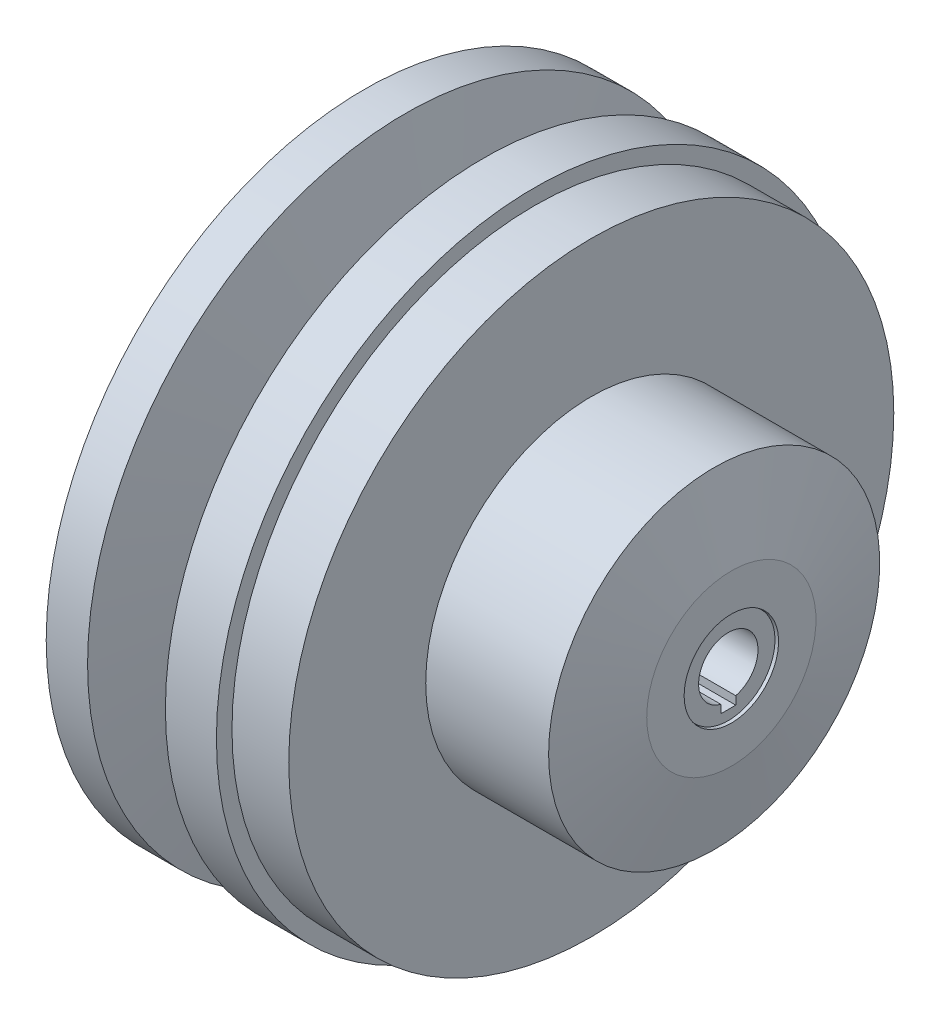
ISO-10303-21;
HEADER;
FILE_DESCRIPTION(('STEP AP214'),'2;1');
FILE_NAME('part.step','',(''),(''),'','','');
FILE_SCHEMA(('AUTOMOTIVE_DESIGN { 1 0 10303 214 1 1 1 1 }'));
ENDSEC;
DATA;
#1=APPLICATION_CONTEXT('core data for automotive mechanical design processes');
#2=APPLICATION_PROTOCOL_DEFINITION('international standard','automotive_design',2000,#1);
#3=PRODUCT_CONTEXT('',#1,'mechanical');
#4=PRODUCT('Part','Part','',(#3));
#5=PRODUCT_RELATED_PRODUCT_CATEGORY('part','',(#4));
#6=PRODUCT_DEFINITION_FORMATION('','',#4);
#7=PRODUCT_DEFINITION_CONTEXT('part definition',#1,'design');
#8=PRODUCT_DEFINITION('design','',#6,#7);
#9=PRODUCT_DEFINITION_SHAPE('','',#8);
#10=(LENGTH_UNIT() NAMED_UNIT(*) SI_UNIT(.MILLI.,.METRE.));
#11=(NAMED_UNIT(*) PLANE_ANGLE_UNIT() SI_UNIT($,.RADIAN.));
#12=(NAMED_UNIT(*) SI_UNIT($,.STERADIAN.) SOLID_ANGLE_UNIT());
#13=UNCERTAINTY_MEASURE_WITH_UNIT(LENGTH_MEASURE(1.E-05),#10,'distance_accuracy_value','');
#14=(GEOMETRIC_REPRESENTATION_CONTEXT(3) GLOBAL_UNCERTAINTY_ASSIGNED_CONTEXT((#13)) GLOBAL_UNIT_ASSIGNED_CONTEXT((#10,
#11,#12)) REPRESENTATION_CONTEXT('',''));
#15=CARTESIAN_POINT('',(0.,0.,0.));
#16=DIRECTION('',(0.,0.,1.));
#17=DIRECTION('',(1.,0.,0.));
#18=AXIS2_PLACEMENT_3D('',#15,#16,#17);
#19=CARTESIAN_POINT('',(-162.990125158944,0.,0.));
#20=DIRECTION('',(1.,0.,0.));
#21=DIRECTION('',(0.,0.,-1.));
#22=AXIS2_PLACEMENT_3D('',#19,#20,#21);
#23=PLANE('',#22);
#24=CARTESIAN_POINT('',(-162.990125158944,0.,0.));
#25=DIRECTION('',(-1.,0.,0.));
#26=DIRECTION('',(0.,0.,1.));
#27=AXIS2_PLACEMENT_3D('',#24,#25,#26);
#28=CIRCLE('',#27,15.125);
#29=CARTESIAN_POINT('',(-162.990125158944,0.,15.125));
#30=VERTEX_POINT('',#29);
#31=EDGE_CURVE('E114',#30,#30,#28,.T.);
#32=ORIENTED_EDGE('',*,*,#31,.F.);
#33=EDGE_LOOP('',(#32));
#34=FACE_BOUND('',#33,.T.);
#35=CARTESIAN_POINT('',(-162.990125158944,0.,0.));
#36=DIRECTION('',(-1.,0.,0.));
#37=DIRECTION('',(0.,0.,1.));
#38=AXIS2_PLACEMENT_3D('',#35,#36,#37);
#39=CIRCLE('',#38,16.125);
#40=CARTESIAN_POINT('',(-162.990125158944,0.,16.125));
#41=VERTEX_POINT('',#40);
#42=EDGE_CURVE('E11',#41,#41,#39,.T.);
#43=ORIENTED_EDGE('',*,*,#42,.T.);
#44=EDGE_LOOP('',(#43));
#45=FACE_BOUND('',#44,.T.);
#46=ADVANCED_FACE('F47',(#34,#45),#23,.F.);
#47=CARTESIAN_POINT('',(-162.990125158944,0.,0.));
#48=DIRECTION('',(-1.,0.,0.));
#49=DIRECTION('',(0.,0.,1.));
#50=AXIS2_PLACEMENT_3D('',#47,#48,#49);
#51=CYLINDRICAL_SURFACE('',#50,16.125);
#52=ORIENTED_EDGE('',*,*,#42,.F.);
#53=EDGE_LOOP('',(#52));
#54=FACE_BOUND('',#53,.T.);
#55=CARTESIAN_POINT('',(-163.990125158944,0.,0.));
#56=DIRECTION('',(-1.,0.,0.));
#57=DIRECTION('',(0.,0.,1.));
#58=AXIS2_PLACEMENT_3D('',#55,#56,#57);
#59=CIRCLE('',#58,16.125);
#60=CARTESIAN_POINT('',(-163.990125158944,0.,16.125));
#61=VERTEX_POINT('',#60);
#62=EDGE_CURVE('E55',#61,#61,#59,.T.);
#63=ORIENTED_EDGE('',*,*,#62,.T.);
#64=EDGE_LOOP('',(#63));
#65=FACE_BOUND('',#64,.T.);
#66=ADVANCED_FACE('F190',(#54,#65),#51,.F.);
#67=CARTESIAN_POINT('',(-163.990125158944,16.125,0.));
#68=DIRECTION('',(1.,0.,0.));
#69=DIRECTION('',(0.,0.,-1.));
#70=AXIS2_PLACEMENT_3D('',#67,#68,#69);
#71=PLANE('',#70);
#72=ORIENTED_EDGE('',*,*,#62,.F.);
#73=EDGE_LOOP('',(#72));
#74=FACE_BOUND('',#73,.T.);
#75=CARTESIAN_POINT('',(-163.990125158944,0.,0.));
#76=DIRECTION('',(-1.,0.,0.));
#77=DIRECTION('',(0.,0.,1.));
#78=AXIS2_PLACEMENT_3D('',#75,#76,#77);
#79=CIRCLE('',#78,37.7414540088167);
#80=CARTESIAN_POINT('',(-163.990125158944,0.,37.7414540088167));
#81=VERTEX_POINT('',#80);
#82=EDGE_CURVE('E183',#81,#81,#79,.T.);
#83=ORIENTED_EDGE('',*,*,#82,.T.);
#84=EDGE_LOOP('',(#83));
#85=FACE_BOUND('',#84,.T.);
#86=ADVANCED_FACE('F192',(#74,#85),#71,.F.);
#87=CARTESIAN_POINT('',(-162.990125158944,0.,0.));
#88=DIRECTION('',(-1.,0.,0.));
#89=DIRECTION('',(0.,0.,1.));
#90=AXIS2_PLACEMENT_3D('',#87,#88,#89);
#91=CYLINDRICAL_SURFACE('',#90,37.7414540088167);
#92=ORIENTED_EDGE('',*,*,#82,.F.);
#93=EDGE_LOOP('',(#92));
#94=FACE_BOUND('',#93,.T.);
#95=CARTESIAN_POINT('',(-160.123125158944,0.,0.));
#96=DIRECTION('',(-1.,0.,0.));
#97=DIRECTION('',(0.,0.,1.));
#98=AXIS2_PLACEMENT_3D('',#95,#96,#97);
#99=CIRCLE('',#98,37.7414540088167);
#100=CARTESIAN_POINT('',(-160.123125158944,0.,37.7414540088167));
#101=VERTEX_POINT('',#100);
#102=EDGE_CURVE('E179',#101,#101,#99,.T.);
#103=ORIENTED_EDGE('',*,*,#102,.T.);
#104=EDGE_LOOP('',(#103));
#105=FACE_BOUND('',#104,.T.);
#106=ADVANCED_FACE('F195',(#94,#105),#91,.T.);
#107=CARTESIAN_POINT('',(-160.123125158944,37.7414540088167,0.));
#108=DIRECTION('',(1.,0.,0.));
#109=DIRECTION('',(0.,0.,-1.));
#110=AXIS2_PLACEMENT_3D('',#107,#108,#109);
#111=PLANE('',#110);
#112=ORIENTED_EDGE('',*,*,#102,.F.);
#113=EDGE_LOOP('',(#112));
#114=FACE_BOUND('',#113,.T.);
#115=CARTESIAN_POINT('',(-160.123125158944,0.,0.));
#116=DIRECTION('',(-1.,0.,0.));
#117=DIRECTION('',(0.,0.,1.));
#118=AXIS2_PLACEMENT_3D('',#115,#116,#117);
#119=CIRCLE('',#118,102.184999119959);
#120=CARTESIAN_POINT('',(-160.123125158944,0.,102.184999119959));
#121=VERTEX_POINT('',#120);
#122=EDGE_CURVE('E175',#121,#121,#119,.T.);
#123=ORIENTED_EDGE('',*,*,#122,.T.);
#124=EDGE_LOOP('',(#123));
#125=FACE_BOUND('',#124,.T.);
#126=ADVANCED_FACE('F201',(#114,#125),#111,.F.);
#127=CARTESIAN_POINT('',(-162.990125158944,0.,0.));
#128=DIRECTION('',(-1.,0.,0.));
#129=DIRECTION('',(0.,0.,1.));
#130=AXIS2_PLACEMENT_3D('',#127,#128,#129);
#131=CYLINDRICAL_SURFACE('',#130,102.184999119959);
#132=ORIENTED_EDGE('',*,*,#122,.F.);
#133=EDGE_LOOP('',(#132));
#134=FACE_BOUND('',#133,.T.);
#135=CARTESIAN_POINT('',(-146.834181254641,0.,0.));
#136=DIRECTION('',(-1.,0.,0.));
#137=DIRECTION('',(0.,0.,1.));
#138=AXIS2_PLACEMENT_3D('',#135,#136,#137);
#139=CIRCLE('',#138,102.184999119959);
#140=CARTESIAN_POINT('',(-146.834181254641,0.,102.184999119959));
#141=VERTEX_POINT('',#140);
#142=EDGE_CURVE('E171',#141,#141,#139,.T.);
#143=ORIENTED_EDGE('',*,*,#142,.T.);
#144=EDGE_LOOP('',(#143));
#145=FACE_BOUND('',#144,.T.);
#146=ADVANCED_FACE('F207',(#134,#145),#131,.T.);
#147=CARTESIAN_POINT('',(-134.834181254641,0.,0.));
#148=DIRECTION('',(-1.,0.,0.));
#149=DIRECTION('',(0.,0.,1.));
#150=AXIS2_PLACEMENT_3D('',#147,#148,#149);
#151=CONICAL_SURFACE('',#150,30.,1.40606327498181);
#152=CARTESIAN_POINT('',(-134.834181254641,0.,0.));
#153=DIRECTION('',(-1.,0.,0.));
#154=DIRECTION('',(0.,0.,1.));
#155=AXIS2_PLACEMENT_3D('',#152,#153,#154);
#156=CIRCLE('',#155,30.);
#157=CARTESIAN_POINT('',(-134.834181254641,0.,29.9999999999999));
#158=VERTEX_POINT('',#157);
#159=EDGE_CURVE('E167',#158,#158,#156,.T.);
#160=CARTESIAN_POINT('',(-146.834181254641,0.,102.184999119959));
#161=CARTESIAN_POINT('',(-146.709181254641,0.,101.433072045793));
#162=CARTESIAN_POINT('',(-146.584181254641,0.,100.681144971627));
#163=CARTESIAN_POINT('',(-146.334181254641,0.,99.1772908232943));
#164=CARTESIAN_POINT('',(-146.209181254641,0.,98.4253637491281));
#165=CARTESIAN_POINT('',(-145.959181254641,0.,96.9215096007956));
#166=CARTESIAN_POINT('',(-145.834181254641,0.,96.1695825266294));
#167=CARTESIAN_POINT('',(-145.584181254641,0.,94.6657283782969));
#168=CARTESIAN_POINT('',(-145.459181254641,0.,93.9138013041306));
#169=CARTESIAN_POINT('',(-145.209181254641,0.,92.4099471557981));
#170=CARTESIAN_POINT('',(-145.084181254641,0.,91.6580200816319));
#171=CARTESIAN_POINT('',(-144.834181254641,0.,90.1541659332994));
#172=CARTESIAN_POINT('',(-144.709181254641,0.,89.4022388591332));
#173=CARTESIAN_POINT('',(-144.459181254641,0.,87.8983847108007));
#174=CARTESIAN_POINT('',(-144.334181254641,0.,87.1464576366344));
#175=CARTESIAN_POINT('',(-144.084181254641,0.,85.642603488302));
#176=CARTESIAN_POINT('',(-143.959181254641,0.,84.8906764141357));
#177=CARTESIAN_POINT('',(-143.709181254641,0.,83.3868222658032));
#178=CARTESIAN_POINT('',(-143.584181254641,0.,82.634895191637));
#179=CARTESIAN_POINT('',(-143.334181254641,0.,81.1310410433045));
#180=CARTESIAN_POINT('',(-143.209181254641,0.,80.3791139691382));
#181=CARTESIAN_POINT('',(-142.959181254641,0.,78.8752598208058));
#182=CARTESIAN_POINT('',(-142.834181254641,0.,78.1233327466395));
#183=CARTESIAN_POINT('',(-142.584181254641,0.,76.619478598307));
#184=CARTESIAN_POINT('',(-142.459181254641,0.,75.8675515241408));
#185=CARTESIAN_POINT('',(-142.209181254641,0.,74.3636973758083));
#186=CARTESIAN_POINT('',(-142.084181254641,0.,73.6117703016421));
#187=CARTESIAN_POINT('',(-141.834181254641,0.,72.1079161533096));
#188=CARTESIAN_POINT('',(-141.709181254641,0.,71.3559890791433));
#189=CARTESIAN_POINT('',(-141.459181254641,0.,69.8521349308108));
#190=CARTESIAN_POINT('',(-141.334181254641,0.,69.1002078566446));
#191=CARTESIAN_POINT('',(-141.084181254641,0.,67.5963537083121));
#192=CARTESIAN_POINT('',(-140.959181254641,0.,66.8444266341459));
#193=CARTESIAN_POINT('',(-140.709181254641,0.,65.3405724858134));
#194=CARTESIAN_POINT('',(-140.584181254641,0.,64.5886454116471));
#195=CARTESIAN_POINT('',(-140.334181254641,0.,63.0847912633146));
#196=CARTESIAN_POINT('',(-140.209181254641,0.,62.3328641891484));
#197=CARTESIAN_POINT('',(-139.959181254641,0.,60.8290100408159));
#198=CARTESIAN_POINT('',(-139.834181254641,0.,60.0770829666497));
#199=CARTESIAN_POINT('',(-139.584181254641,0.,58.5732288183172));
#200=CARTESIAN_POINT('',(-139.459181254641,0.,57.8213017441509));
#201=CARTESIAN_POINT('',(-139.209181254641,0.,56.3174475958184));
#202=CARTESIAN_POINT('',(-139.084181254641,0.,55.5655205216522));
#203=CARTESIAN_POINT('',(-138.834181254641,0.,54.0616663733197));
#204=CARTESIAN_POINT('',(-138.709181254641,0.,53.3097392991535));
#205=CARTESIAN_POINT('',(-138.459181254641,0.,51.805885150821));
#206=CARTESIAN_POINT('',(-138.334181254641,0.,51.0539580766547));
#207=CARTESIAN_POINT('',(-138.084181254641,0.,49.5501039283223));
#208=CARTESIAN_POINT('',(-137.959181254641,0.,48.798176854156));
#209=CARTESIAN_POINT('',(-137.709181254641,0.,47.2943227058235));
#210=CARTESIAN_POINT('',(-137.584181254641,0.,46.5423956316573));
#211=CARTESIAN_POINT('',(-137.334181254641,0.,45.0385414833248));
#212=CARTESIAN_POINT('',(-137.209181254641,0.,44.2866144091585));
#213=CARTESIAN_POINT('',(-136.959181254641,0.,42.7827602608261));
#214=CARTESIAN_POINT('',(-136.834181254641,0.,42.0308331866598));
#215=CARTESIAN_POINT('',(-136.584181254641,0.,40.5269790383273));
#216=CARTESIAN_POINT('',(-136.459181254641,0.,39.7750519641611));
#217=CARTESIAN_POINT('',(-136.209181254641,0.,38.2711978158286));
#218=CARTESIAN_POINT('',(-136.084181254641,0.,37.5192707416624));
#219=CARTESIAN_POINT('',(-135.834181254641,0.,36.0154165933299));
#220=CARTESIAN_POINT('',(-135.709181254641,0.,35.2634895191636));
#221=CARTESIAN_POINT('',(-135.459181254641,0.,33.7596353708311));
#222=CARTESIAN_POINT('',(-135.334181254641,0.,33.0077082966649));
#223=CARTESIAN_POINT('',(-135.084181254641,0.,31.5038541483324));
#224=CARTESIAN_POINT('',(-134.959181254641,0.,30.7519270741662));
#225=CARTESIAN_POINT('',(-134.834181254641,0.,29.9999999999999));
#226=B_SPLINE_CURVE_WITH_KNOTS('',3,(#160,#161,#162,#163,#164,#165,#166,#167,#168,#169,#170,
#171,#172,#173,#174,#175,#176,#177,#178,#179,#180,#181,#182,#183,#184,#185,#186,#187,#188,#189,
#190,#191,#192,#193,#194,#195,#196,#197,#198,#199,#200,#201,#202,#203,#204,#205,#206,#207,#208,
#209,#210,#211,#212,#213,#214,#215,#216,#217,#218,#219,#220,#221,#222,#223,#224,#225),
.UNSPECIFIED.,.F.,.F.,(4,2,2,2,2,2,2,2,2,2,2,2,2,2,2,2,2,2,2,2,2,2,2,2,2,2,2,2,2,2,2,2,4),(0.,
2.28673870911784,4.57347741823566,6.86021612735349,9.14695483647132,11.4336935455891,
13.720432254707,16.0071709638248,18.2939096729426,20.5806483820605,22.8673870911783,
25.1541258002961,27.4408645094139,29.7276032185318,32.0143419276496,34.3010806367674,
36.5878193458852,38.8745580550031,41.1612967641209,43.4480354732387,45.7347741823566,
48.0215128914744,50.3082516005922,52.59499030971,54.8817290188279,57.1684677279457,
59.4552064370635,61.7419451461814,64.0286838552992,66.315422564417,68.6021612735348,
70.8888999826527,73.1756386917705),.UNSPECIFIED.);
#227=EDGE_CURVE('BSEAM213',#141,#158,#226,.T.);
#228=ORIENTED_EDGE('',*,*,#142,.F.);
#229=ORIENTED_EDGE('',*,*,#159,.T.);
#230=ORIENTED_EDGE('',*,*,#227,.T.);
#231=ORIENTED_EDGE('',*,*,#227,.F.);
#232=EDGE_LOOP('',(#228,#230,#229,#231));
#233=FACE_BOUND('',#232,.T.);
#234=ADVANCED_FACE('F213',(#233),#151,.T.);
#235=CARTESIAN_POINT('',(-162.990125158944,0.,0.));
#236=DIRECTION('',(-1.,0.,0.));
#237=DIRECTION('',(0.,0.,1.));
#238=AXIS2_PLACEMENT_3D('',#235,#236,#237);
#239=CYLINDRICAL_SURFACE('',#238,30.);
#240=ORIENTED_EDGE('',*,*,#159,.F.);
#241=EDGE_LOOP('',(#240));
#242=FACE_BOUND('',#241,.T.);
#243=CARTESIAN_POINT('',(-133.834181254641,0.,0.));
#244=DIRECTION('',(-1.,0.,0.));
#245=DIRECTION('',(0.,0.,1.));
#246=AXIS2_PLACEMENT_3D('',#243,#244,#245);
#247=CIRCLE('',#246,30.);
#248=CARTESIAN_POINT('',(-133.834181254641,0.,-30.));
#249=VERTEX_POINT('',#248);
#250=EDGE_CURVE('E163',#249,#249,#247,.T.);
#251=ORIENTED_EDGE('',*,*,#250,.T.);
#252=EDGE_LOOP('',(#251));
#253=FACE_BOUND('',#252,.T.);
#254=ADVANCED_FACE('F219',(#242,#253),#239,.T.);
#255=CARTESIAN_POINT('',(-121.834181254641,0.,0.));
#256=DIRECTION('',(1.,0.,0.));
#257=DIRECTION('',(0.,0.,-1.));
#258=AXIS2_PLACEMENT_3D('',#255,#256,#257);
#259=CONICAL_SURFACE('',#258,102.184999119959,1.40606327498181);
#260=CARTESIAN_POINT('',(-121.834181254641,0.,0.));
#261=DIRECTION('',(-1.,0.,0.));
#262=DIRECTION('',(0.,0.,1.));
#263=AXIS2_PLACEMENT_3D('',#260,#261,#262);
#264=CIRCLE('',#263,102.184999119959);
#265=CARTESIAN_POINT('',(-121.834181254641,0.,-102.184999119959));
#266=VERTEX_POINT('',#265);
#267=EDGE_CURVE('E159',#266,#266,#264,.T.);
#268=CARTESIAN_POINT('',(-133.834181254641,0.,-30.));
#269=CARTESIAN_POINT('',(-133.709181254641,0.,-30.7519270741663));
#270=CARTESIAN_POINT('',(-133.584181254641,0.,-31.5038541483325));
#271=CARTESIAN_POINT('',(-133.334181254641,0.,-33.007708296665));
#272=CARTESIAN_POINT('',(-133.209181254641,0.,-33.7596353708313));
#273=CARTESIAN_POINT('',(-132.959181254641,0.,-35.2634895191637));
#274=CARTESIAN_POINT('',(-132.834181254641,0.,-36.01541659333));
#275=CARTESIAN_POINT('',(-132.584181254641,0.,-37.5192707416625));
#276=CARTESIAN_POINT('',(-132.459181254641,0.,-38.2711978158287));
#277=CARTESIAN_POINT('',(-132.209181254641,0.,-39.7750519641612));
#278=CARTESIAN_POINT('',(-132.084181254641,0.,-40.5269790383274));
#279=CARTESIAN_POINT('',(-131.834181254641,0.,-42.0308331866599));
#280=CARTESIAN_POINT('',(-131.709181254641,0.,-42.7827602608262));
#281=CARTESIAN_POINT('',(-131.459181254641,0.,-44.2866144091587));
#282=CARTESIAN_POINT('',(-131.334181254641,0.,-45.0385414833249));
#283=CARTESIAN_POINT('',(-131.084181254641,0.,-46.5423956316574));
#284=CARTESIAN_POINT('',(-130.959181254641,0.,-47.2943227058236));
#285=CARTESIAN_POINT('',(-130.709181254641,0.,-48.7981768541561));
#286=CARTESIAN_POINT('',(-130.584181254641,0.,-49.5501039283224));
#287=CARTESIAN_POINT('',(-130.334181254641,0.,-51.0539580766549));
#288=CARTESIAN_POINT('',(-130.209181254641,0.,-51.8058851508211));
#289=CARTESIAN_POINT('',(-129.959181254641,0.,-53.3097392991536));
#290=CARTESIAN_POINT('',(-129.834181254641,0.,-54.0616663733198));
#291=CARTESIAN_POINT('',(-129.584181254641,0.,-55.5655205216523));
#292=CARTESIAN_POINT('',(-129.459181254641,0.,-56.3174475958186));
#293=CARTESIAN_POINT('',(-129.209181254641,0.,-57.821301744151));
#294=CARTESIAN_POINT('',(-129.084181254641,0.,-58.5732288183173));
#295=CARTESIAN_POINT('',(-128.834181254641,0.,-60.0770829666498));
#296=CARTESIAN_POINT('',(-128.709181254641,0.,-60.829010040816));
#297=CARTESIAN_POINT('',(-128.459181254641,0.,-62.3328641891485));
#298=CARTESIAN_POINT('',(-128.334181254641,0.,-63.0847912633147));
#299=CARTESIAN_POINT('',(-128.084181254641,0.,-64.5886454116472));
#300=CARTESIAN_POINT('',(-127.959181254641,0.,-65.3405724858135));
#301=CARTESIAN_POINT('',(-127.709181254641,0.,-66.844426634146));
#302=CARTESIAN_POINT('',(-127.584181254641,0.,-67.5963537083122));
#303=CARTESIAN_POINT('',(-127.334181254641,0.,-69.1002078566447));
#304=CARTESIAN_POINT('',(-127.209181254641,0.,-69.8521349308109));
#305=CARTESIAN_POINT('',(-126.959181254641,0.,-71.3559890791434));
#306=CARTESIAN_POINT('',(-126.834181254641,0.,-72.1079161533097));
#307=CARTESIAN_POINT('',(-126.584181254641,0.,-73.6117703016422));
#308=CARTESIAN_POINT('',(-126.459181254641,0.,-74.3636973758084));
#309=CARTESIAN_POINT('',(-126.209181254641,0.,-75.8675515241409));
#310=CARTESIAN_POINT('',(-126.084181254641,0.,-76.6194785983071));
#311=CARTESIAN_POINT('',(-125.834181254641,0.,-78.1233327466396));
#312=CARTESIAN_POINT('',(-125.709181254641,0.,-78.8752598208058));
#313=CARTESIAN_POINT('',(-125.459181254641,0.,-80.3791139691383));
#314=CARTESIAN_POINT('',(-125.334181254641,0.,-81.1310410433046));
#315=CARTESIAN_POINT('',(-125.084181254641,0.,-82.6348951916371));
#316=CARTESIAN_POINT('',(-124.959181254641,0.,-83.3868222658033));
#317=CARTESIAN_POINT('',(-124.709181254641,0.,-84.8906764141358));
#318=CARTESIAN_POINT('',(-124.584181254641,0.,-85.642603488302));
#319=CARTESIAN_POINT('',(-124.334181254641,0.,-87.1464576366345));
#320=CARTESIAN_POINT('',(-124.209181254641,0.,-87.8983847108008));
#321=CARTESIAN_POINT('',(-123.959181254641,0.,-89.4022388591333));
#322=CARTESIAN_POINT('',(-123.834181254641,0.,-90.1541659332995));
#323=CARTESIAN_POINT('',(-123.584181254641,0.,-91.658020081632));
#324=CARTESIAN_POINT('',(-123.459181254641,0.,-92.4099471557982));
#325=CARTESIAN_POINT('',(-123.209181254641,0.,-93.9138013041307));
#326=CARTESIAN_POINT('',(-123.084181254641,0.,-94.6657283782969));
#327=CARTESIAN_POINT('',(-122.834181254641,0.,-96.1695825266294));
#328=CARTESIAN_POINT('',(-122.709181254641,0.,-96.9215096007957));
#329=CARTESIAN_POINT('',(-122.459181254641,0.,-98.4253637491282));
#330=CARTESIAN_POINT('',(-122.334181254641,0.,-99.1772908232944));
#331=CARTESIAN_POINT('',(-122.084181254641,0.,-100.681144971627));
#332=CARTESIAN_POINT('',(-121.959181254641,0.,-101.433072045793));
#333=CARTESIAN_POINT('',(-121.834181254641,0.,-102.184999119959));
#334=B_SPLINE_CURVE_WITH_KNOTS('',3,(#268,#269,#270,#271,#272,#273,#274,#275,#276,#277,#278,
#279,#280,#281,#282,#283,#284,#285,#286,#287,#288,#289,#290,#291,#292,#293,#294,#295,#296,#297,
#298,#299,#300,#301,#302,#303,#304,#305,#306,#307,#308,#309,#310,#311,#312,#313,#314,#315,#316,
#317,#318,#319,#320,#321,#322,#323,#324,#325,#326,#327,#328,#329,#330,#331,#332,#333),
.UNSPECIFIED.,.F.,.F.,(4,2,2,2,2,2,2,2,2,2,2,2,2,2,2,2,2,2,2,2,2,2,2,2,2,2,2,2,2,2,2,2,4),(0.,
2.28673870911784,4.57347741823566,6.86021612735349,9.14695483647132,11.4336935455891,
13.720432254707,16.0071709638248,18.2939096729426,20.5806483820604,22.8673870911783,
25.1541258002961,27.4408645094139,29.7276032185318,32.0143419276496,34.3010806367674,
36.5878193458852,38.8745580550031,41.1612967641209,43.4480354732387,45.7347741823565,
48.0215128914744,50.3082516005922,52.59499030971,54.8817290188278,57.1684677279457,
59.4552064370635,61.7419451461813,64.0286838552991,66.315422564417,68.6021612735348,
70.8888999826526,73.1756386917705),.UNSPECIFIED.);
#335=EDGE_CURVE('BSEAM225',#249,#266,#334,.T.);
#336=ORIENTED_EDGE('',*,*,#250,.F.);
#337=ORIENTED_EDGE('',*,*,#267,.T.);
#338=ORIENTED_EDGE('',*,*,#335,.T.);
#339=ORIENTED_EDGE('',*,*,#335,.F.);
#340=EDGE_LOOP('',(#336,#338,#337,#339));
#341=FACE_BOUND('',#340,.T.);
#342=ADVANCED_FACE('F225',(#341),#259,.T.);
#343=CARTESIAN_POINT('',(-162.990125158944,0.,0.));
#344=DIRECTION('',(-1.,0.,0.));
#345=DIRECTION('',(0.,0.,1.));
#346=AXIS2_PLACEMENT_3D('',#343,#344,#345);
#347=CYLINDRICAL_SURFACE('',#346,102.184999119959);
#348=ORIENTED_EDGE('',*,*,#267,.F.);
#349=EDGE_LOOP('',(#348));
#350=FACE_BOUND('',#349,.T.);
#351=CARTESIAN_POINT('',(-105.445019466081,0.,0.));
#352=DIRECTION('',(-1.,0.,0.));
#353=DIRECTION('',(0.,0.,1.));
#354=AXIS2_PLACEMENT_3D('',#351,#352,#353);
#355=CIRCLE('',#354,102.184999119959);
#356=CARTESIAN_POINT('',(-105.445019466081,0.,102.184999119959));
#357=VERTEX_POINT('',#356);
#358=EDGE_CURVE('E155',#357,#357,#355,.T.);
#359=ORIENTED_EDGE('',*,*,#358,.T.);
#360=EDGE_LOOP('',(#359));
#361=FACE_BOUND('',#360,.T.);
#362=ADVANCED_FACE('F231',(#350,#361),#347,.T.);
#363=CARTESIAN_POINT('',(-105.445019466081,102.184999119959,0.));
#364=DIRECTION('',(-1.,0.,0.));
#365=DIRECTION('',(0.,0.,1.));
#366=AXIS2_PLACEMENT_3D('',#363,#364,#365);
#367=PLANE('',#366);
#368=ORIENTED_EDGE('',*,*,#358,.F.);
#369=EDGE_LOOP('',(#368));
#370=FACE_BOUND('',#369,.T.);
#371=CARTESIAN_POINT('',(-105.445019466081,0.,0.));
#372=DIRECTION('',(-1.,0.,0.));
#373=DIRECTION('',(0.,0.,1.));
#374=AXIS2_PLACEMENT_3D('',#371,#372,#373);
#375=CIRCLE('',#374,97.1849991199594);
#376=CARTESIAN_POINT('',(-105.445019466081,0.,97.1849991199594));
#377=VERTEX_POINT('',#376);
#378=EDGE_CURVE('E151',#377,#377,#375,.T.);
#379=ORIENTED_EDGE('',*,*,#378,.T.);
#380=EDGE_LOOP('',(#379));
#381=FACE_BOUND('',#380,.T.);
#382=ADVANCED_FACE('F237',(#370,#381),#367,.F.);
#383=CARTESIAN_POINT('',(-162.990125158944,0.,0.));
#384=DIRECTION('',(-1.,0.,0.));
#385=DIRECTION('',(0.,0.,1.));
#386=AXIS2_PLACEMENT_3D('',#383,#384,#385);
#387=CYLINDRICAL_SURFACE('',#386,97.1849991199594);
#388=ORIENTED_EDGE('',*,*,#378,.F.);
#389=EDGE_LOOP('',(#388));
#390=FACE_BOUND('',#389,.T.);
#391=CARTESIAN_POINT('',(-87.2065524695211,0.,0.));
#392=DIRECTION('',(-1.,0.,0.));
#393=DIRECTION('',(0.,0.,1.));
#394=AXIS2_PLACEMENT_3D('',#391,#392,#393);
#395=CIRCLE('',#394,97.1849991199594);
#396=CARTESIAN_POINT('',(-87.2065524695211,0.,97.1849991199594));
#397=VERTEX_POINT('',#396);
#398=EDGE_CURVE('E147',#397,#397,#395,.T.);
#399=ORIENTED_EDGE('',*,*,#398,.T.);
#400=EDGE_LOOP('',(#399));
#401=FACE_BOUND('',#400,.T.);
#402=ADVANCED_FACE('F243',(#390,#401),#387,.T.);
#403=CARTESIAN_POINT('',(-87.2065524695211,97.1849991199594,0.));
#404=DIRECTION('',(-1.,0.,0.));
#405=DIRECTION('',(0.,0.,1.));
#406=AXIS2_PLACEMENT_3D('',#403,#404,#405);
#407=PLANE('',#406);
#408=ORIENTED_EDGE('',*,*,#398,.F.);
#409=EDGE_LOOP('',(#408));
#410=FACE_BOUND('',#409,.T.);
#411=CARTESIAN_POINT('',(-87.2065524695211,0.,0.));
#412=DIRECTION('',(-1.,0.,0.));
#413=DIRECTION('',(0.,0.,1.));
#414=AXIS2_PLACEMENT_3D('',#411,#412,#413);
#415=CIRCLE('',#414,53.1849991199594);
#416=CARTESIAN_POINT('',(-87.2065524695211,0.,53.1849991199594));
#417=VERTEX_POINT('',#416);
#418=EDGE_CURVE('E143',#417,#417,#415,.T.);
#419=ORIENTED_EDGE('',*,*,#418,.T.);
#420=EDGE_LOOP('',(#419));
#421=FACE_BOUND('',#420,.T.);
#422=ADVANCED_FACE('F249',(#410,#421),#407,.F.);
#423=CARTESIAN_POINT('',(-162.990125158944,0.,0.));
#424=DIRECTION('',(-1.,0.,0.));
#425=DIRECTION('',(0.,0.,1.));
#426=AXIS2_PLACEMENT_3D('',#423,#424,#425);
#427=CYLINDRICAL_SURFACE('',#426,53.1849991199594);
#428=ORIENTED_EDGE('',*,*,#418,.F.);
#429=EDGE_LOOP('',(#428));
#430=FACE_BOUND('',#429,.T.);
#431=CARTESIAN_POINT('',(-47.7330230729417,0.,0.));
#432=DIRECTION('',(-1.,0.,0.));
#433=DIRECTION('',(0.,0.,1.));
#434=AXIS2_PLACEMENT_3D('',#431,#432,#433);
#435=CIRCLE('',#434,53.1849991199594);
#436=CARTESIAN_POINT('',(-47.7330230729417,0.,53.1849991199594));
#437=VERTEX_POINT('',#436);
#438=EDGE_CURVE('E139',#437,#437,#435,.T.);
#439=ORIENTED_EDGE('',*,*,#438,.T.);
#440=EDGE_LOOP('',(#439));
#441=FACE_BOUND('',#440,.T.);
#442=ADVANCED_FACE('F255',(#430,#441),#427,.T.);
#443=CARTESIAN_POINT('',(-42.2065524695211,0.,0.));
#444=DIRECTION('',(-1.,0.,0.));
#445=DIRECTION('',(0.,0.,1.));
#446=AXIS2_PLACEMENT_3D('',#443,#444,#445);
#447=CONICAL_SURFACE('',#446,27.1849991199594,1.36135681655558);
#448=ORIENTED_EDGE('',*,*,#438,.F.);
#449=EDGE_LOOP('',(#448));
#450=FACE_BOUND('',#449,.T.);
#451=CARTESIAN_POINT('',(-42.2065524695211,0.,0.));
#452=DIRECTION('',(-1.,0.,0.));
#453=DIRECTION('',(0.,0.,1.));
#454=AXIS2_PLACEMENT_3D('',#451,#452,#453);
#455=CIRCLE('',#454,27.1849991199594);
#456=CARTESIAN_POINT('',(-42.2065524695211,0.,27.1849991199594));
#457=VERTEX_POINT('',#456);
#458=EDGE_CURVE('E135',#457,#457,#455,.T.);
#459=ORIENTED_EDGE('',*,*,#458,.T.);
#460=EDGE_LOOP('',(#459));
#461=FACE_BOUND('',#460,.T.);
#462=ADVANCED_FACE('F261',(#450,#461),#447,.T.);
#463=CARTESIAN_POINT('',(-42.2065524695211,27.1849991199594,0.));
#464=DIRECTION('',(-1.,0.,0.));
#465=DIRECTION('',(0.,0.,1.));
#466=AXIS2_PLACEMENT_3D('',#463,#464,#465);
#467=PLANE('',#466);
#468=ORIENTED_EDGE('',*,*,#458,.F.);
#469=EDGE_LOOP('',(#468));
#470=FACE_BOUND('',#469,.T.);
#471=CARTESIAN_POINT('',(-42.2065524695211,0.,0.));
#472=DIRECTION('',(-1.,0.,0.));
#473=DIRECTION('',(0.,0.,1.));
#474=AXIS2_PLACEMENT_3D('',#471,#472,#473);
#475=CIRCLE('',#474,15.1738902498917);
#476=CARTESIAN_POINT('',(-42.2065524695211,0.,15.1738902498917));
#477=VERTEX_POINT('',#476);
#478=EDGE_CURVE('E131',#477,#477,#475,.T.);
#479=ORIENTED_EDGE('',*,*,#478,.T.);
#480=EDGE_LOOP('',(#479));
#481=FACE_BOUND('',#480,.T.);
#482=ADVANCED_FACE('F267',(#470,#481),#467,.F.);
#483=CARTESIAN_POINT('',(-43.1901251589438,0.,0.));
#484=DIRECTION('',(1.,0.,0.));
#485=DIRECTION('',(0.,0.,-1.));
#486=AXIS2_PLACEMENT_3D('',#483,#484,#485);
#487=CONICAL_SURFACE('',#486,14.9933777444476,0.181507491500948);
#488=ORIENTED_EDGE('',*,*,#478,.F.);
#489=EDGE_LOOP('',(#488));
#490=FACE_BOUND('',#489,.T.);
#491=CARTESIAN_POINT('',(-43.1901251589438,0.,0.));
#492=DIRECTION('',(-1.,0.,0.));
#493=DIRECTION('',(0.,0.,1.));
#494=AXIS2_PLACEMENT_3D('',#491,#492,#493);
#495=CIRCLE('',#494,14.9933777444476);
#496=CARTESIAN_POINT('',(-43.1901251589438,0.,14.9933777444476));
#497=VERTEX_POINT('',#496);
#498=EDGE_CURVE('E126',#497,#497,#495,.T.);
#499=ORIENTED_EDGE('',*,*,#498,.T.);
#500=EDGE_LOOP('',(#499));
#501=FACE_BOUND('',#500,.T.);
#502=ADVANCED_FACE('F273',(#490,#501),#487,.F.);
#503=CARTESIAN_POINT('',(-43.1901251589438,14.9933777444476,0.));
#504=DIRECTION('',(-1.,0.,0.));
#505=DIRECTION('',(0.,0.,1.));
#506=AXIS2_PLACEMENT_3D('',#503,#504,#505);
#507=PLANE('',#506);
#508=CARTESIAN_POINT('',(-43.1901251589438,0.,0.));
#509=DIRECTION('',(-1.,0.,0.));
#510=DIRECTION('',(0.,0.,1.));
#511=AXIS2_PLACEMENT_3D('',#508,#509,#510);
#512=CIRCLE('',#511,9.543);
#513=CARTESIAN_POINT('',(-43.1901251589438,-9.23627895854169,-2.4));
#514=VERTEX_POINT('',#513);
#515=CARTESIAN_POINT('',(-43.1901251589438,-9.23627895854169,2.4));
#516=VERTEX_POINT('',#515);
#517=EDGE_CURVE('E102',#514,#516,#512,.F.);
#518=ORIENTED_EDGE('',*,*,#517,.F.);
#519=DIRECTION('',(0.,1.,0.));
#520=VECTOR('',#519,1.);
#521=CARTESIAN_POINT('',(-43.1901251589438,-7.219,-2.4));
#522=LINE('',#521,#520);
#523=CARTESIAN_POINT('',(-43.1901251589438,-11.867,-2.4));
#524=VERTEX_POINT('',#523);
#525=EDGE_CURVE('E87',#524,#514,#522,.T.);
#526=ORIENTED_EDGE('',*,*,#525,.F.);
#527=DIRECTION('',(0.,0.,-1.));
#528=VECTOR('',#527,1.);
#529=CARTESIAN_POINT('',(-43.1901251589438,-11.867,2.4));
#530=LINE('',#529,#528);
#531=CARTESIAN_POINT('',(-43.1901251589438,-11.867,2.4));
#532=VERTEX_POINT('',#531);
#533=EDGE_CURVE('E445',#532,#524,#530,.T.);
#534=ORIENTED_EDGE('',*,*,#533,.F.);
#535=DIRECTION('',(0.,-1.,0.));
#536=VECTOR('',#535,1.);
#537=CARTESIAN_POINT('',(-43.1901251589438,-7.219,2.4));
#538=LINE('',#537,#536);
#539=EDGE_CURVE('E95',#516,#532,#538,.T.);
#540=ORIENTED_EDGE('',*,*,#539,.F.);
#541=EDGE_LOOP('',(#518,#526,#534,#540));
#542=FACE_BOUND('',#541,.T.);
#543=ORIENTED_EDGE('',*,*,#498,.F.);
#544=EDGE_LOOP('',(#543));
#545=FACE_BOUND('',#544,.T.);
#546=ADVANCED_FACE('F110',(#542,#545),#507,.F.);
#547=CARTESIAN_POINT('',(-138.590125158944,0.,0.));
#548=DIRECTION('',(-1.,0.,0.));
#549=DIRECTION('',(0.,0.,1.));
#550=AXIS2_PLACEMENT_3D('',#547,#548,#549);
#551=CYLINDRICAL_SURFACE('',#550,15.125);
#552=CARTESIAN_POINT('',(-138.590125158944,0.,0.));
#553=DIRECTION('',(-1.,0.,0.));
#554=DIRECTION('',(0.,0.,1.));
#555=AXIS2_PLACEMENT_3D('',#552,#553,#554);
#556=CIRCLE('',#555,15.125);
#557=CARTESIAN_POINT('',(-138.590125158944,0.,15.125));
#558=VERTEX_POINT('',#557);
#559=EDGE_CURVE('E119',#558,#558,#556,.T.);
#560=ORIENTED_EDGE('',*,*,#559,.F.);
#561=EDGE_LOOP('',(#560));
#562=FACE_BOUND('',#561,.T.);
#563=ORIENTED_EDGE('',*,*,#31,.T.);
#564=EDGE_LOOP('',(#563));
#565=FACE_BOUND('',#564,.T.);
#566=ADVANCED_FACE('F282',(#562,#565),#551,.F.);
#567=CARTESIAN_POINT('',(-138.590125158944,0.,0.));
#568=DIRECTION('',(-1.,0.,0.));
#569=DIRECTION('',(0.,0.,1.));
#570=AXIS2_PLACEMENT_3D('',#567,#568,#569);
#571=PLANE('',#570);
#572=DIRECTION('',(0.,1.,0.));
#573=VECTOR('',#572,1.);
#574=CARTESIAN_POINT('',(-138.590125158944,-7.219,-2.4));
#575=LINE('',#574,#573);
#576=CARTESIAN_POINT('',(-138.590125158944,-11.867,-2.4));
#577=VERTEX_POINT('',#576);
#578=CARTESIAN_POINT('',(-138.590125158944,-9.23627895854169,-2.4));
#579=VERTEX_POINT('',#578);
#580=EDGE_CURVE('E96',#577,#579,#575,.T.);
#581=ORIENTED_EDGE('',*,*,#580,.T.);
#582=CARTESIAN_POINT('',(-138.590125158944,0.,0.));
#583=DIRECTION('',(-1.,0.,0.));
#584=DIRECTION('',(0.,0.,1.));
#585=AXIS2_PLACEMENT_3D('',#582,#583,#584);
#586=CIRCLE('',#585,9.543);
#587=CARTESIAN_POINT('',(-138.590125158944,-9.23627895854169,2.4));
#588=VERTEX_POINT('',#587);
#589=EDGE_CURVE('E104',#588,#579,#586,.T.);
#590=ORIENTED_EDGE('',*,*,#589,.F.);
#591=DIRECTION('',(0.,-1.,0.));
#592=VECTOR('',#591,1.);
#593=CARTESIAN_POINT('',(-138.590125158944,-7.219,2.4));
#594=LINE('',#593,#592);
#595=CARTESIAN_POINT('',(-138.590125158944,-11.867,2.4));
#596=VERTEX_POINT('',#595);
#597=EDGE_CURVE('E62',#588,#596,#594,.T.);
#598=ORIENTED_EDGE('',*,*,#597,.T.);
#599=DIRECTION('',(0.,0.,-1.));
#600=VECTOR('',#599,1.);
#601=CARTESIAN_POINT('',(-138.590125158944,-11.867,2.4));
#602=LINE('',#601,#600);
#603=EDGE_CURVE('E106',#596,#577,#602,.T.);
#604=ORIENTED_EDGE('',*,*,#603,.T.);
#605=EDGE_LOOP('',(#581,#590,#598,#604));
#606=FACE_BOUND('',#605,.T.);
#607=ORIENTED_EDGE('',*,*,#559,.T.);
#608=EDGE_LOOP('',(#607));
#609=FACE_BOUND('',#608,.T.);
#610=ADVANCED_FACE('F288',(#606,#609),#571,.T.);
#611=CARTESIAN_POINT('',(-42.2055524695211,0.,0.));
#612=DIRECTION('',(-1.,0.,0.));
#613=DIRECTION('',(0.,0.,1.));
#614=AXIS2_PLACEMENT_3D('',#611,#612,#613);
#615=CYLINDRICAL_SURFACE('',#614,9.543);
#616=ORIENTED_EDGE('',*,*,#589,.T.);
#617=DIRECTION('',(-1.,0.,0.));
#618=VECTOR('',#617,1.);
#619=CARTESIAN_POINT('',(-42.2055524695211,-9.23627895854169,-2.4));
#620=LINE('',#619,#618);
#621=EDGE_CURVE('E70',#514,#579,#620,.T.);
#622=ORIENTED_EDGE('',*,*,#621,.F.);
#623=ORIENTED_EDGE('',*,*,#517,.T.);
#624=DIRECTION('',(-1.,0.,0.));
#625=VECTOR('',#624,1.);
#626=CARTESIAN_POINT('',(-42.2055524695211,-9.23627895854169,2.4));
#627=LINE('',#626,#625);
#628=EDGE_CURVE('E107',#588,#516,#627,.F.);
#629=ORIENTED_EDGE('',*,*,#628,.F.);
#630=EDGE_LOOP('',(#616,#622,#623,#629));
#631=FACE_BOUND('',#630,.T.);
#632=ADVANCED_FACE('F101',(#631),#615,.F.);
#633=CARTESIAN_POINT('',(-163.991125158944,-7.219,-2.4));
#634=DIRECTION('',(0.,0.,-1.));
#635=DIRECTION('',(0.,1.,0.));
#636=AXIS2_PLACEMENT_3D('',#633,#634,#635);
#637=PLANE('',#636);
#638=DIRECTION('',(1.,0.,0.));
#639=VECTOR('',#638,1.);
#640=CARTESIAN_POINT('',(-163.991125158944,-11.867,-2.4));
#641=LINE('',#640,#639);
#642=EDGE_CURVE('E89',#577,#524,#641,.T.);
#643=ORIENTED_EDGE('',*,*,#642,.T.);
#644=ORIENTED_EDGE('',*,*,#525,.T.);
#645=ORIENTED_EDGE('',*,*,#621,.T.);
#646=ORIENTED_EDGE('',*,*,#580,.F.);
#647=EDGE_LOOP('',(#643,#644,#645,#646));
#648=FACE_BOUND('',#647,.T.);
#649=ADVANCED_FACE('F88',(#648),#637,.F.);
#650=CARTESIAN_POINT('',(-163.991125158944,-11.867,2.4));
#651=DIRECTION('',(0.,-1.,0.));
#652=DIRECTION('',(0.,0.,-1.));
#653=AXIS2_PLACEMENT_3D('',#650,#651,#652);
#654=PLANE('',#653);
#655=DIRECTION('',(1.,0.,0.));
#656=VECTOR('',#655,1.);
#657=CARTESIAN_POINT('',(-163.991125158944,-11.867,2.4));
#658=LINE('',#657,#656);
#659=EDGE_CURVE('E448',#596,#532,#658,.T.);
#660=ORIENTED_EDGE('',*,*,#659,.T.);
#661=ORIENTED_EDGE('',*,*,#533,.T.);
#662=ORIENTED_EDGE('',*,*,#642,.F.);
#663=ORIENTED_EDGE('',*,*,#603,.F.);
#664=EDGE_LOOP('',(#660,#661,#662,#663));
#665=FACE_BOUND('',#664,.T.);
#666=ADVANCED_FACE('F414',(#665),#654,.F.);
#667=CARTESIAN_POINT('',(-163.991125158944,-7.219,2.4));
#668=DIRECTION('',(0.,0.,1.));
#669=DIRECTION('',(0.,-1.,0.));
#670=AXIS2_PLACEMENT_3D('',#667,#668,#669);
#671=PLANE('',#670);
#672=ORIENTED_EDGE('',*,*,#628,.T.);
#673=ORIENTED_EDGE('',*,*,#539,.T.);
#674=ORIENTED_EDGE('',*,*,#659,.F.);
#675=ORIENTED_EDGE('',*,*,#597,.F.);
#676=EDGE_LOOP('',(#672,#673,#674,#675));
#677=FACE_BOUND('',#676,.T.);
#678=ADVANCED_FACE('F423',(#677),#671,.F.);
#679=CLOSED_SHELL('',(#46,#66,#86,#106,#126,#146,#234,#254,#342,#362,#382,#402,#422,#442,#462,
#482,#502,#546,#566,#610,#632,#649,#666,#678));
#680=MANIFOLD_SOLID_BREP('B2',#679);
#681=ADVANCED_BREP_SHAPE_REPRESENTATION('',(#18,#680),#14);
#682=SHAPE_DEFINITION_REPRESENTATION(#9,#681);
ENDSEC;
END-ISO-10303-21;
